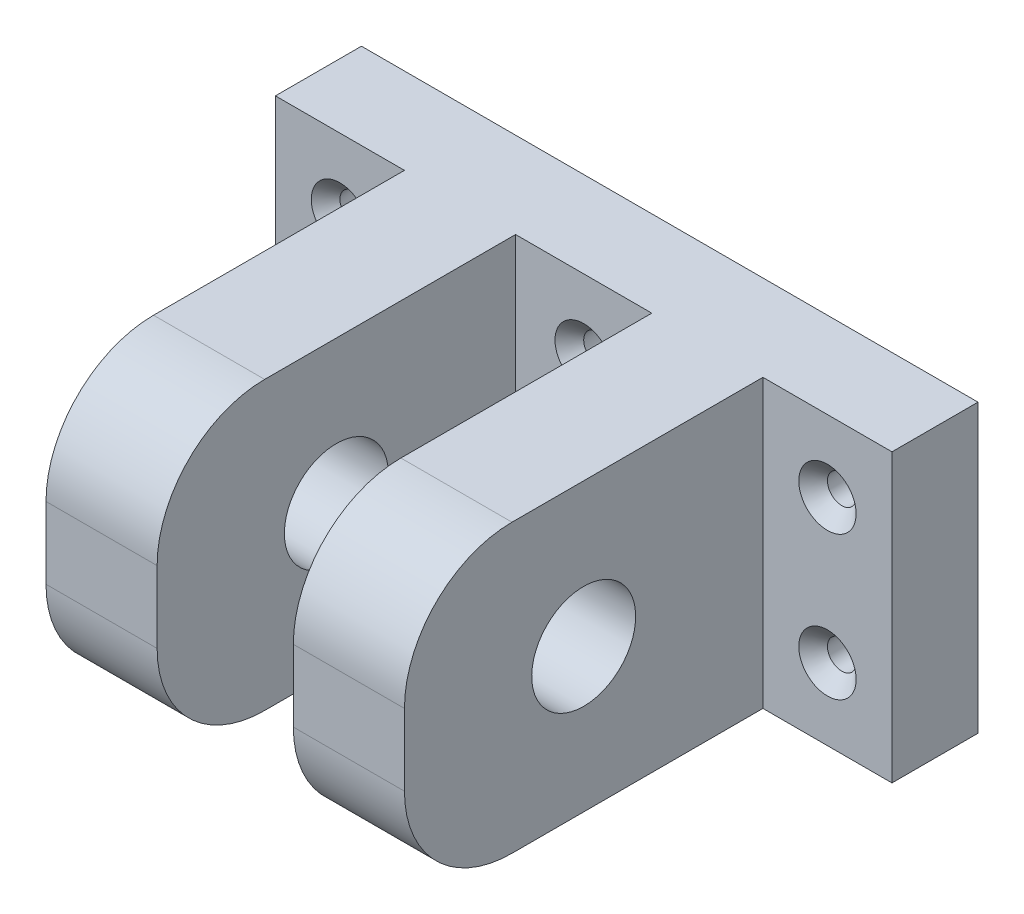
ISO-10303-21;
HEADER;
FILE_DESCRIPTION(('STEP AP214'),'2;1');
FILE_NAME('part.step','',(''),(''),'','','');
FILE_SCHEMA(('AUTOMOTIVE_DESIGN { 1 0 10303 214 1 1 1 1 }'));
ENDSEC;
DATA;
#1=APPLICATION_CONTEXT('core data for automotive mechanical design processes');
#2=APPLICATION_PROTOCOL_DEFINITION('international standard','automotive_design',2000,#1);
#3=PRODUCT_CONTEXT('',#1,'mechanical');
#4=PRODUCT('Part','Part','',(#3));
#5=PRODUCT_RELATED_PRODUCT_CATEGORY('part','',(#4));
#6=PRODUCT_DEFINITION_FORMATION('','',#4);
#7=PRODUCT_DEFINITION_CONTEXT('part definition',#1,'design');
#8=PRODUCT_DEFINITION('design','',#6,#7);
#9=PRODUCT_DEFINITION_SHAPE('','',#8);
#10=(LENGTH_UNIT() NAMED_UNIT(*) SI_UNIT(.MILLI.,.METRE.));
#11=(NAMED_UNIT(*) PLANE_ANGLE_UNIT() SI_UNIT($,.RADIAN.));
#12=(NAMED_UNIT(*) SI_UNIT($,.STERADIAN.) SOLID_ANGLE_UNIT());
#13=UNCERTAINTY_MEASURE_WITH_UNIT(LENGTH_MEASURE(1.E-05),#10,'distance_accuracy_value','');
#14=(GEOMETRIC_REPRESENTATION_CONTEXT(3) GLOBAL_UNCERTAINTY_ASSIGNED_CONTEXT((#13)) GLOBAL_UNIT_ASSIGNED_CONTEXT((#10,
#11,#12)) REPRESENTATION_CONTEXT('',''));
#15=CARTESIAN_POINT('',(0.,0.,0.));
#16=DIRECTION('',(0.,0.,1.));
#17=DIRECTION('',(1.,0.,0.));
#18=AXIS2_PLACEMENT_3D('',#15,#16,#17);
#19=CARTESIAN_POINT('',(0.,0.,12.));
#20=DIRECTION('',(0.,0.,-1.));
#21=DIRECTION('',(-1.,0.,0.));
#22=AXIS2_PLACEMENT_3D('',#19,#20,#21);
#23=PLANE('',#22);
#24=CARTESIAN_POINT('',(43.,10.,12.));
#25=DIRECTION('',(0.,0.,-1.));
#26=DIRECTION('',(-1.,0.,0.));
#27=AXIS2_PLACEMENT_3D('',#24,#25,#26);
#28=CIRCLE('',#27,4.);
#29=CARTESIAN_POINT('',(39.,10.,12.));
#30=VERTEX_POINT('',#29);
#31=EDGE_CURVE('E314',#30,#30,#28,.T.);
#32=ORIENTED_EDGE('',*,*,#31,.T.);
#33=EDGE_LOOP('',(#32));
#34=FACE_BOUND('',#33,.T.);
#35=CARTESIAN_POINT('',(43.,30.,12.));
#36=DIRECTION('',(0.,0.,-1.));
#37=DIRECTION('',(-1.,0.,0.));
#38=AXIS2_PLACEMENT_3D('',#35,#36,#37);
#39=CIRCLE('',#38,4.);
#40=CARTESIAN_POINT('',(39.,30.,12.));
#41=VERTEX_POINT('',#40);
#42=EDGE_CURVE('E311',#41,#41,#39,.T.);
#43=ORIENTED_EDGE('',*,*,#42,.T.);
#44=EDGE_LOOP('',(#43));
#45=FACE_BOUND('',#44,.T.);
#46=DIRECTION('',(0.,-1.,0.));
#47=VECTOR('',#46,1.);
#48=CARTESIAN_POINT('',(52.5,40.,12.));
#49=LINE('',#48,#47);
#50=CARTESIAN_POINT('',(52.5,40.,12.));
#51=VERTEX_POINT('',#50);
#52=CARTESIAN_POINT('',(52.5,0.,12.));
#53=VERTEX_POINT('',#52);
#54=EDGE_CURVE('E155',#51,#53,#49,.T.);
#55=ORIENTED_EDGE('',*,*,#54,.F.);
#56=DIRECTION('',(-1.,0.,0.));
#57=VECTOR('',#56,1.);
#58=CARTESIAN_POINT('',(0.,40.,12.));
#59=LINE('',#58,#57);
#60=CARTESIAN_POINT('',(33.5,40.,12.));
#61=VERTEX_POINT('',#60);
#62=EDGE_CURVE('E163',#51,#61,#59,.T.);
#63=ORIENTED_EDGE('',*,*,#62,.T.);
#64=DIRECTION('',(0.,1.,0.));
#65=VECTOR('',#64,1.);
#66=CARTESIAN_POINT('',(33.5,40.,12.));
#67=LINE('',#66,#65);
#68=CARTESIAN_POINT('',(33.5,0.,12.));
#69=VERTEX_POINT('',#68);
#70=EDGE_CURVE('E199',#69,#61,#67,.T.);
#71=ORIENTED_EDGE('',*,*,#70,.F.);
#72=DIRECTION('',(1.,0.,0.));
#73=VECTOR('',#72,1.);
#74=CARTESIAN_POINT('',(0.,0.,12.));
#75=LINE('',#74,#73);
#76=EDGE_CURVE('E176',#69,#53,#75,.T.);
#77=ORIENTED_EDGE('',*,*,#76,.T.);
#78=EDGE_LOOP('',(#55,#63,#71,#77));
#79=FACE_BOUND('',#78,.T.);
#80=ADVANCED_FACE('F35',(#34,#45,#79),#23,.F.);
#81=CARTESIAN_POINT('',(77.,10.,12.));
#82=DIRECTION('',(0.,0.,-1.));
#83=DIRECTION('',(-1.,0.,0.));
#84=AXIS2_PLACEMENT_3D('',#81,#82,#83);
#85=CIRCLE('',#84,4.);
#86=CARTESIAN_POINT('',(73.,10.,12.));
#87=VERTEX_POINT('',#86);
#88=EDGE_CURVE('E302',#87,#87,#85,.T.);
#89=ORIENTED_EDGE('',*,*,#88,.T.);
#90=EDGE_LOOP('',(#89));
#91=FACE_BOUND('',#90,.T.);
#92=CARTESIAN_POINT('',(77.,30.,12.));
#93=DIRECTION('',(0.,0.,-1.));
#94=DIRECTION('',(-1.,0.,0.));
#95=AXIS2_PLACEMENT_3D('',#92,#93,#94);
#96=CIRCLE('',#95,4.);
#97=CARTESIAN_POINT('',(73.,30.,12.));
#98=VERTEX_POINT('',#97);
#99=EDGE_CURVE('E299',#98,#98,#96,.T.);
#100=ORIENTED_EDGE('',*,*,#99,.T.);
#101=EDGE_LOOP('',(#100));
#102=FACE_BOUND('',#101,.T.);
#103=DIRECTION('',(0.,1.,0.));
#104=VECTOR('',#103,1.);
#105=CARTESIAN_POINT('',(68.,40.,12.));
#106=LINE('',#105,#104);
#107=CARTESIAN_POINT('',(68.,0.,12.));
#108=VERTEX_POINT('',#107);
#109=CARTESIAN_POINT('',(68.,40.,12.));
#110=VERTEX_POINT('',#109);
#111=EDGE_CURVE('E177',#108,#110,#106,.T.);
#112=ORIENTED_EDGE('',*,*,#111,.F.);
#113=CARTESIAN_POINT('',(86.,0.,12.));
#114=VERTEX_POINT('',#113);
#115=EDGE_CURVE('E216',#108,#114,#75,.T.);
#116=ORIENTED_EDGE('',*,*,#115,.T.);
#117=DIRECTION('',(0.,1.,0.));
#118=VECTOR('',#117,1.);
#119=CARTESIAN_POINT('',(86.,0.,12.));
#120=LINE('',#119,#118);
#121=CARTESIAN_POINT('',(86.,40.,12.));
#122=VERTEX_POINT('',#121);
#123=EDGE_CURVE('E221',#114,#122,#120,.T.);
#124=ORIENTED_EDGE('',*,*,#123,.T.);
#125=EDGE_CURVE('E171',#122,#110,#59,.T.);
#126=ORIENTED_EDGE('',*,*,#125,.T.);
#127=EDGE_LOOP('',(#112,#116,#124,#126));
#128=FACE_BOUND('',#127,.T.);
#129=ADVANCED_FACE('F369',(#91,#102,#128),#23,.F.);
#130=CARTESIAN_POINT('',(9.,10.,12.));
#131=DIRECTION('',(0.,0.,-1.));
#132=DIRECTION('',(-1.,0.,0.));
#133=AXIS2_PLACEMENT_3D('',#130,#131,#132);
#134=CIRCLE('',#133,4.00000000000001);
#135=CARTESIAN_POINT('',(4.99999999999999,10.,12.));
#136=VERTEX_POINT('',#135);
#137=EDGE_CURVE('E44',#136,#136,#134,.T.);
#138=ORIENTED_EDGE('',*,*,#137,.T.);
#139=EDGE_LOOP('',(#138));
#140=FACE_BOUND('',#139,.T.);
#141=CARTESIAN_POINT('',(9.,30.,12.));
#142=DIRECTION('',(0.,0.,-1.));
#143=DIRECTION('',(-1.,0.,0.));
#144=AXIS2_PLACEMENT_3D('',#141,#142,#143);
#145=CIRCLE('',#144,4.00000000000001);
#146=CARTESIAN_POINT('',(4.99999999999999,30.,12.));
#147=VERTEX_POINT('',#146);
#148=EDGE_CURVE('E323',#147,#147,#145,.T.);
#149=ORIENTED_EDGE('',*,*,#148,.T.);
#150=EDGE_LOOP('',(#149));
#151=FACE_BOUND('',#150,.T.);
#152=DIRECTION('',(0.,-1.,0.));
#153=VECTOR('',#152,1.);
#154=CARTESIAN_POINT('',(18.,40.,12.));
#155=LINE('',#154,#153);
#156=CARTESIAN_POINT('',(18.,40.,12.));
#157=VERTEX_POINT('',#156);
#158=CARTESIAN_POINT('',(18.,0.,12.));
#159=VERTEX_POINT('',#158);
#160=EDGE_CURVE('E194',#157,#159,#155,.T.);
#161=ORIENTED_EDGE('',*,*,#160,.F.);
#162=CARTESIAN_POINT('',(0.,40.,12.));
#163=VERTEX_POINT('',#162);
#164=EDGE_CURVE('E172',#157,#163,#59,.T.);
#165=ORIENTED_EDGE('',*,*,#164,.T.);
#166=DIRECTION('',(0.,-1.,0.));
#167=VECTOR('',#166,1.);
#168=CARTESIAN_POINT('',(0.,0.,12.));
#169=LINE('',#168,#167);
#170=CARTESIAN_POINT('',(0.,0.,12.));
#171=VERTEX_POINT('',#170);
#172=EDGE_CURVE('E213',#163,#171,#169,.T.);
#173=ORIENTED_EDGE('',*,*,#172,.T.);
#174=EDGE_CURVE('E218',#171,#159,#75,.T.);
#175=ORIENTED_EDGE('',*,*,#174,.T.);
#176=EDGE_LOOP('',(#161,#165,#173,#175));
#177=FACE_BOUND('',#176,.T.);
#178=ADVANCED_FACE('F391',(#140,#151,#177),#23,.F.);
#179=CARTESIAN_POINT('',(0.,0.,12.));
#180=DIRECTION('',(1.,0.,0.));
#181=DIRECTION('',(0.,0.,-1.));
#182=AXIS2_PLACEMENT_3D('',#179,#180,#181);
#183=PLANE('',#182);
#184=DIRECTION('',(0.,-1.,0.));
#185=VECTOR('',#184,1.);
#186=CARTESIAN_POINT('',(0.,0.,0.));
#187=LINE('',#186,#185);
#188=CARTESIAN_POINT('',(0.,40.,0.));
#189=VERTEX_POINT('',#188);
#190=CARTESIAN_POINT('',(0.,0.,0.));
#191=VERTEX_POINT('',#190);
#192=EDGE_CURVE('E212',#189,#191,#187,.T.);
#193=ORIENTED_EDGE('',*,*,#192,.T.);
#194=DIRECTION('',(0.,0.,-1.));
#195=VECTOR('',#194,1.);
#196=CARTESIAN_POINT('',(0.,0.,12.));
#197=LINE('',#196,#195);
#198=EDGE_CURVE('E240',#171,#191,#197,.T.);
#199=ORIENTED_EDGE('',*,*,#198,.F.);
#200=ORIENTED_EDGE('',*,*,#172,.F.);
#201=DIRECTION('',(0.,0.,-1.));
#202=VECTOR('',#201,1.);
#203=CARTESIAN_POINT('',(0.,40.,12.));
#204=LINE('',#203,#202);
#205=EDGE_CURVE('E224',#163,#189,#204,.T.);
#206=ORIENTED_EDGE('',*,*,#205,.T.);
#207=EDGE_LOOP('',(#193,#199,#200,#206));
#208=FACE_BOUND('',#207,.T.);
#209=ADVANCED_FACE('F385',(#208),#183,.F.);
#210=CARTESIAN_POINT('',(0.,0.,12.));
#211=DIRECTION('',(0.,1.,0.));
#212=DIRECTION('',(0.,0.,1.));
#213=AXIS2_PLACEMENT_3D('',#210,#211,#212);
#214=PLANE('',#213);
#215=DIRECTION('',(0.,0.,-1.));
#216=VECTOR('',#215,1.);
#217=CARTESIAN_POINT('',(33.5,0.,62.));
#218=LINE('',#217,#216);
#219=CARTESIAN_POINT('',(33.5,0.,47.));
#220=VERTEX_POINT('',#219);
#221=EDGE_CURVE('E208',#220,#69,#218,.T.);
#222=ORIENTED_EDGE('',*,*,#221,.F.);
#223=DIRECTION('',(1.,0.,0.));
#224=VECTOR('',#223,1.);
#225=CARTESIAN_POINT('',(18.,0.,47.));
#226=LINE('',#225,#224);
#227=CARTESIAN_POINT('',(18.,0.,47.));
#228=VERTEX_POINT('',#227);
#229=EDGE_CURVE('E274',#220,#228,#226,.F.);
#230=ORIENTED_EDGE('',*,*,#229,.T.);
#231=DIRECTION('',(0.,0.,-1.));
#232=VECTOR('',#231,1.);
#233=CARTESIAN_POINT('',(18.,0.,62.));
#234=LINE('',#233,#232);
#235=EDGE_CURVE('E210',#228,#159,#234,.T.);
#236=ORIENTED_EDGE('',*,*,#235,.T.);
#237=ORIENTED_EDGE('',*,*,#174,.F.);
#238=ORIENTED_EDGE('',*,*,#198,.T.);
#239=DIRECTION('',(1.,0.,0.));
#240=VECTOR('',#239,1.);
#241=CARTESIAN_POINT('',(0.,0.,0.));
#242=LINE('',#241,#240);
#243=CARTESIAN_POINT('',(86.,0.,0.));
#244=VERTEX_POINT('',#243);
#245=EDGE_CURVE('E227',#191,#244,#242,.T.);
#246=ORIENTED_EDGE('',*,*,#245,.T.);
#247=DIRECTION('',(0.,0.,-1.));
#248=VECTOR('',#247,1.);
#249=CARTESIAN_POINT('',(86.,0.,12.));
#250=LINE('',#249,#248);
#251=EDGE_CURVE('E237',#114,#244,#250,.T.);
#252=ORIENTED_EDGE('',*,*,#251,.F.);
#253=ORIENTED_EDGE('',*,*,#115,.F.);
#254=DIRECTION('',(0.,0.,-1.));
#255=VECTOR('',#254,1.);
#256=CARTESIAN_POINT('',(68.,0.,62.));
#257=LINE('',#256,#255);
#258=CARTESIAN_POINT('',(68.,0.,47.));
#259=VERTEX_POINT('',#258);
#260=EDGE_CURVE('E190',#259,#108,#257,.T.);
#261=ORIENTED_EDGE('',*,*,#260,.F.);
#262=DIRECTION('',(1.,0.,0.));
#263=VECTOR('',#262,1.);
#264=CARTESIAN_POINT('',(52.5,0.,47.));
#265=LINE('',#264,#263);
#266=CARTESIAN_POINT('',(52.5,0.,47.));
#267=VERTEX_POINT('',#266);
#268=EDGE_CURVE('E59',#259,#267,#265,.F.);
#269=ORIENTED_EDGE('',*,*,#268,.T.);
#270=DIRECTION('',(0.,0.,-1.));
#271=VECTOR('',#270,1.);
#272=CARTESIAN_POINT('',(52.5,0.,62.));
#273=LINE('',#272,#271);
#274=EDGE_CURVE('E192',#267,#53,#273,.T.);
#275=ORIENTED_EDGE('',*,*,#274,.T.);
#276=ORIENTED_EDGE('',*,*,#76,.F.);
#277=EDGE_LOOP('',(#222,#230,#236,#237,#238,#246,#252,#253,#261,#269,#275,#276));
#278=FACE_BOUND('',#277,.T.);
#279=ADVANCED_FACE('F372',(#278),#214,.F.);
#280=CARTESIAN_POINT('',(86.,0.,12.));
#281=DIRECTION('',(-1.,0.,0.));
#282=DIRECTION('',(0.,0.,1.));
#283=AXIS2_PLACEMENT_3D('',#280,#281,#282);
#284=PLANE('',#283);
#285=DIRECTION('',(0.,1.,0.));
#286=VECTOR('',#285,1.);
#287=CARTESIAN_POINT('',(86.,0.,0.));
#288=LINE('',#287,#286);
#289=CARTESIAN_POINT('',(86.,40.,0.));
#290=VERTEX_POINT('',#289);
#291=EDGE_CURVE('E229',#244,#290,#288,.T.);
#292=ORIENTED_EDGE('',*,*,#291,.T.);
#293=DIRECTION('',(0.,0.,-1.));
#294=VECTOR('',#293,1.);
#295=CARTESIAN_POINT('',(86.,40.,12.));
#296=LINE('',#295,#294);
#297=EDGE_CURVE('E234',#122,#290,#296,.T.);
#298=ORIENTED_EDGE('',*,*,#297,.F.);
#299=ORIENTED_EDGE('',*,*,#123,.F.);
#300=ORIENTED_EDGE('',*,*,#251,.T.);
#301=EDGE_LOOP('',(#292,#298,#299,#300));
#302=FACE_BOUND('',#301,.T.);
#303=ADVANCED_FACE('F377',(#302),#284,.F.);
#304=CARTESIAN_POINT('',(0.,40.,12.));
#305=DIRECTION('',(0.,-1.,0.));
#306=DIRECTION('',(0.,0.,-1.));
#307=AXIS2_PLACEMENT_3D('',#304,#305,#306);
#308=PLANE('',#307);
#309=DIRECTION('',(0.,0.,-1.));
#310=VECTOR('',#309,1.);
#311=CARTESIAN_POINT('',(18.,40.,62.));
#312=LINE('',#311,#310);
#313=CARTESIAN_POINT('',(18.,40.,47.));
#314=VERTEX_POINT('',#313);
#315=EDGE_CURVE('E202',#314,#157,#312,.T.);
#316=ORIENTED_EDGE('',*,*,#315,.F.);
#317=DIRECTION('',(-1.,0.,0.));
#318=VECTOR('',#317,1.);
#319=CARTESIAN_POINT('',(33.5,40.,47.));
#320=LINE('',#319,#318);
#321=CARTESIAN_POINT('',(33.5,40.,47.));
#322=VERTEX_POINT('',#321);
#323=EDGE_CURVE('E255',#314,#322,#320,.F.);
#324=ORIENTED_EDGE('',*,*,#323,.T.);
#325=DIRECTION('',(0.,0.,-1.));
#326=VECTOR('',#325,1.);
#327=CARTESIAN_POINT('',(33.5,40.,62.));
#328=LINE('',#327,#326);
#329=EDGE_CURVE('E167',#322,#61,#328,.T.);
#330=ORIENTED_EDGE('',*,*,#329,.T.);
#331=ORIENTED_EDGE('',*,*,#62,.F.);
#332=DIRECTION('',(0.,0.,-1.));
#333=VECTOR('',#332,1.);
#334=CARTESIAN_POINT('',(52.5,40.,62.));
#335=LINE('',#334,#333);
#336=CARTESIAN_POINT('',(52.5,40.,47.));
#337=VERTEX_POINT('',#336);
#338=EDGE_CURVE('E150',#337,#51,#335,.T.);
#339=ORIENTED_EDGE('',*,*,#338,.F.);
#340=DIRECTION('',(-1.,0.,0.));
#341=VECTOR('',#340,1.);
#342=CARTESIAN_POINT('',(68.,40.,47.));
#343=LINE('',#342,#341);
#344=CARTESIAN_POINT('',(68.,40.,47.));
#345=VERTEX_POINT('',#344);
#346=EDGE_CURVE('E253',#337,#345,#343,.F.);
#347=ORIENTED_EDGE('',*,*,#346,.T.);
#348=DIRECTION('',(0.,0.,-1.));
#349=VECTOR('',#348,1.);
#350=CARTESIAN_POINT('',(68.,40.,62.));
#351=LINE('',#350,#349);
#352=EDGE_CURVE('E159',#345,#110,#351,.T.);
#353=ORIENTED_EDGE('',*,*,#352,.T.);
#354=ORIENTED_EDGE('',*,*,#125,.F.);
#355=ORIENTED_EDGE('',*,*,#297,.T.);
#356=DIRECTION('',(-1.,0.,0.));
#357=VECTOR('',#356,1.);
#358=CARTESIAN_POINT('',(0.,40.,0.));
#359=LINE('',#358,#357);
#360=EDGE_CURVE('E217',#290,#189,#359,.T.);
#361=ORIENTED_EDGE('',*,*,#360,.T.);
#362=ORIENTED_EDGE('',*,*,#205,.F.);
#363=ORIENTED_EDGE('',*,*,#164,.F.);
#364=EDGE_LOOP('',(#316,#324,#330,#331,#339,#347,#353,#354,#355,#361,#362,#363));
#365=FACE_BOUND('',#364,.T.);
#366=ADVANCED_FACE('F165',(#365),#308,.F.);
#367=CARTESIAN_POINT('',(0.,0.,0.));
#368=DIRECTION('',(0.,0.,-1.));
#369=DIRECTION('',(-1.,0.,0.));
#370=AXIS2_PLACEMENT_3D('',#367,#368,#369);
#371=PLANE('',#370);
#372=CARTESIAN_POINT('',(40.,20.,0.));
#373=DIRECTION('',(0.,0.,-1.));
#374=DIRECTION('',(-1.,0.,0.));
#375=AXIS2_PLACEMENT_3D('',#372,#373,#374);
#376=CIRCLE('',#375,5.);
#377=CARTESIAN_POINT('',(35.,20.,0.));
#378=VERTEX_POINT('',#377);
#379=EDGE_CURVE('E343',#378,#378,#376,.T.);
#380=ORIENTED_EDGE('',*,*,#379,.F.);
#381=EDGE_LOOP('',(#380));
#382=FACE_BOUND('',#381,.T.);
#383=CARTESIAN_POINT('',(10.,20.,0.));
#384=DIRECTION('',(0.,0.,-1.));
#385=DIRECTION('',(-1.,0.,0.));
#386=AXIS2_PLACEMENT_3D('',#383,#384,#385);
#387=CIRCLE('',#386,5.);
#388=CARTESIAN_POINT('',(5.,20.,0.));
#389=VERTEX_POINT('',#388);
#390=EDGE_CURVE('E336',#389,#389,#387,.T.);
#391=ORIENTED_EDGE('',*,*,#390,.F.);
#392=EDGE_LOOP('',(#391));
#393=FACE_BOUND('',#392,.T.);
#394=CARTESIAN_POINT('',(77.,10.,0.));
#395=DIRECTION('',(0.,0.,-1.));
#396=DIRECTION('',(-1.,0.,0.));
#397=AXIS2_PLACEMENT_3D('',#394,#395,#396);
#398=CIRCLE('',#397,2.);
#399=CARTESIAN_POINT('',(75.,10.,0.));
#400=VERTEX_POINT('',#399);
#401=EDGE_CURVE('E281',#400,#400,#398,.T.);
#402=ORIENTED_EDGE('',*,*,#401,.F.);
#403=EDGE_LOOP('',(#402));
#404=FACE_BOUND('',#403,.T.);
#405=CARTESIAN_POINT('',(77.,30.,0.));
#406=DIRECTION('',(0.,0.,-1.));
#407=DIRECTION('',(-1.,0.,0.));
#408=AXIS2_PLACEMENT_3D('',#405,#406,#407);
#409=CIRCLE('',#408,2.);
#410=CARTESIAN_POINT('',(75.,30.,0.));
#411=VERTEX_POINT('',#410);
#412=EDGE_CURVE('E292',#411,#411,#409,.T.);
#413=ORIENTED_EDGE('',*,*,#412,.F.);
#414=EDGE_LOOP('',(#413));
#415=FACE_BOUND('',#414,.T.);
#416=CARTESIAN_POINT('',(43.,10.,0.));
#417=DIRECTION('',(0.,0.,-1.));
#418=DIRECTION('',(-1.,0.,0.));
#419=AXIS2_PLACEMENT_3D('',#416,#417,#418);
#420=CIRCLE('',#419,2.);
#421=CARTESIAN_POINT('',(41.,10.,0.));
#422=VERTEX_POINT('',#421);
#423=EDGE_CURVE('E289',#422,#422,#420,.T.);
#424=ORIENTED_EDGE('',*,*,#423,.F.);
#425=EDGE_LOOP('',(#424));
#426=FACE_BOUND('',#425,.T.);
#427=CARTESIAN_POINT('',(43.,30.,0.));
#428=DIRECTION('',(0.,0.,-1.));
#429=DIRECTION('',(-1.,0.,0.));
#430=AXIS2_PLACEMENT_3D('',#427,#428,#429);
#431=CIRCLE('',#430,2.);
#432=CARTESIAN_POINT('',(41.,30.,0.));
#433=VERTEX_POINT('',#432);
#434=EDGE_CURVE('E285',#433,#433,#431,.T.);
#435=ORIENTED_EDGE('',*,*,#434,.F.);
#436=EDGE_LOOP('',(#435));
#437=FACE_BOUND('',#436,.T.);
#438=CARTESIAN_POINT('',(9.,10.,0.));
#439=DIRECTION('',(0.,0.,-1.));
#440=DIRECTION('',(-1.,0.,0.));
#441=AXIS2_PLACEMENT_3D('',#438,#439,#440);
#442=CIRCLE('',#441,2.);
#443=CARTESIAN_POINT('',(7.,10.,0.));
#444=VERTEX_POINT('',#443);
#445=EDGE_CURVE('E282',#444,#444,#442,.T.);
#446=ORIENTED_EDGE('',*,*,#445,.F.);
#447=EDGE_LOOP('',(#446));
#448=FACE_BOUND('',#447,.T.);
#449=CARTESIAN_POINT('',(9.,30.,0.));
#450=DIRECTION('',(0.,0.,-1.));
#451=DIRECTION('',(-1.,0.,0.));
#452=AXIS2_PLACEMENT_3D('',#449,#450,#451);
#453=CIRCLE('',#452,2.);
#454=CARTESIAN_POINT('',(7.,30.,0.));
#455=VERTEX_POINT('',#454);
#456=EDGE_CURVE('E277',#455,#455,#453,.T.);
#457=ORIENTED_EDGE('',*,*,#456,.F.);
#458=EDGE_LOOP('',(#457));
#459=FACE_BOUND('',#458,.T.);
#460=ORIENTED_EDGE('',*,*,#192,.F.);
#461=ORIENTED_EDGE('',*,*,#360,.F.);
#462=ORIENTED_EDGE('',*,*,#291,.F.);
#463=ORIENTED_EDGE('',*,*,#245,.F.);
#464=EDGE_LOOP('',(#460,#461,#462,#463));
#465=FACE_BOUND('',#464,.T.);
#466=ADVANCED_FACE('F382',(#382,#393,#404,#415,#426,#437,#448,#459,#465),#371,.T.);
#467=CARTESIAN_POINT('',(18.,40.,62.));
#468=DIRECTION('',(1.,0.,0.));
#469=DIRECTION('',(0.,1.,0.));
#470=AXIS2_PLACEMENT_3D('',#467,#468,#469);
#471=PLANE('',#470);
#472=CARTESIAN_POINT('',(18.,20.,37.));
#473=DIRECTION('',(-1.,0.,0.));
#474=DIRECTION('',(0.,-1.,0.));
#475=AXIS2_PLACEMENT_3D('',#472,#473,#474);
#476=CIRCLE('',#475,7.25);
#477=CARTESIAN_POINT('',(18.,12.75,37.));
#478=VERTEX_POINT('',#477);
#479=EDGE_CURVE('E280',#478,#478,#476,.T.);
#480=ORIENTED_EDGE('',*,*,#479,.F.);
#481=EDGE_LOOP('',(#480));
#482=FACE_BOUND('',#481,.T.);
#483=DIRECTION('',(0.,-1.,0.));
#484=VECTOR('',#483,1.);
#485=CARTESIAN_POINT('',(18.,40.,62.));
#486=LINE('',#485,#484);
#487=CARTESIAN_POINT('',(18.,25.,62.));
#488=VERTEX_POINT('',#487);
#489=CARTESIAN_POINT('',(18.,15.,62.));
#490=VERTEX_POINT('',#489);
#491=EDGE_CURVE('E195',#488,#490,#486,.T.);
#492=ORIENTED_EDGE('',*,*,#491,.F.);
#493=CARTESIAN_POINT('',(18.,25.,47.));
#494=DIRECTION('',(1.,0.,0.));
#495=DIRECTION('',(0.,1.,0.));
#496=AXIS2_PLACEMENT_3D('',#493,#494,#495);
#497=CIRCLE('',#496,15.);
#498=EDGE_CURVE('E251',#488,#314,#497,.F.);
#499=ORIENTED_EDGE('',*,*,#498,.T.);
#500=ORIENTED_EDGE('',*,*,#315,.T.);
#501=ORIENTED_EDGE('',*,*,#160,.T.);
#502=ORIENTED_EDGE('',*,*,#235,.F.);
#503=CARTESIAN_POINT('',(18.,15.,47.));
#504=DIRECTION('',(1.,0.,0.));
#505=DIRECTION('',(0.,1.,0.));
#506=AXIS2_PLACEMENT_3D('',#503,#504,#505);
#507=CIRCLE('',#506,15.);
#508=EDGE_CURVE('E249',#228,#490,#507,.F.);
#509=ORIENTED_EDGE('',*,*,#508,.T.);
#510=EDGE_LOOP('',(#492,#499,#500,#501,#502,#509));
#511=FACE_BOUND('',#510,.T.);
#512=ADVANCED_FACE('F395',(#482,#511),#471,.F.);
#513=CARTESIAN_POINT('',(33.5,40.,62.));
#514=DIRECTION('',(-1.,0.,0.));
#515=DIRECTION('',(0.,-1.,0.));
#516=AXIS2_PLACEMENT_3D('',#513,#514,#515);
#517=PLANE('',#516);
#518=CARTESIAN_POINT('',(33.5,20.,37.));
#519=DIRECTION('',(-1.,0.,0.));
#520=DIRECTION('',(0.,-1.,0.));
#521=AXIS2_PLACEMENT_3D('',#518,#519,#520);
#522=CIRCLE('',#521,7.25);
#523=CARTESIAN_POINT('',(33.5,12.75,37.));
#524=VERTEX_POINT('',#523);
#525=EDGE_CURVE('E178',#524,#524,#522,.T.);
#526=ORIENTED_EDGE('',*,*,#525,.T.);
#527=EDGE_LOOP('',(#526));
#528=FACE_BOUND('',#527,.T.);
#529=ORIENTED_EDGE('',*,*,#329,.F.);
#530=CARTESIAN_POINT('',(33.5,25.,47.));
#531=DIRECTION('',(-1.,0.,0.));
#532=DIRECTION('',(0.,-1.,0.));
#533=AXIS2_PLACEMENT_3D('',#530,#531,#532);
#534=CIRCLE('',#533,15.);
#535=CARTESIAN_POINT('',(33.5,25.,62.));
#536=VERTEX_POINT('',#535);
#537=EDGE_CURVE('E259',#322,#536,#534,.F.);
#538=ORIENTED_EDGE('',*,*,#537,.T.);
#539=DIRECTION('',(0.,1.,0.));
#540=VECTOR('',#539,1.);
#541=CARTESIAN_POINT('',(33.5,40.,62.));
#542=LINE('',#541,#540);
#543=CARTESIAN_POINT('',(33.5,15.,62.));
#544=VERTEX_POINT('',#543);
#545=EDGE_CURVE('E198',#544,#536,#542,.T.);
#546=ORIENTED_EDGE('',*,*,#545,.F.);
#547=CARTESIAN_POINT('',(33.5,15.,47.));
#548=DIRECTION('',(-1.,0.,0.));
#549=DIRECTION('',(0.,-1.,0.));
#550=AXIS2_PLACEMENT_3D('',#547,#548,#549);
#551=CIRCLE('',#550,15.);
#552=EDGE_CURVE('E257',#544,#220,#551,.F.);
#553=ORIENTED_EDGE('',*,*,#552,.T.);
#554=ORIENTED_EDGE('',*,*,#221,.T.);
#555=ORIENTED_EDGE('',*,*,#70,.T.);
#556=EDGE_LOOP('',(#529,#538,#546,#553,#554,#555));
#557=FACE_BOUND('',#556,.T.);
#558=ADVANCED_FACE('F406',(#528,#557),#517,.F.);
#559=CARTESIAN_POINT('',(0.,0.,62.));
#560=DIRECTION('',(0.,0.,1.));
#561=DIRECTION('',(1.,0.,0.));
#562=AXIS2_PLACEMENT_3D('',#559,#560,#561);
#563=PLANE('',#562);
#564=ORIENTED_EDGE('',*,*,#545,.T.);
#565=DIRECTION('',(-1.,0.,0.));
#566=VECTOR('',#565,1.);
#567=CARTESIAN_POINT('',(18.,25.,62.));
#568=LINE('',#567,#566);
#569=EDGE_CURVE('E246',#536,#488,#568,.T.);
#570=ORIENTED_EDGE('',*,*,#569,.T.);
#571=ORIENTED_EDGE('',*,*,#491,.T.);
#572=DIRECTION('',(1.,0.,0.));
#573=VECTOR('',#572,1.);
#574=CARTESIAN_POINT('',(33.5,15.,62.));
#575=LINE('',#574,#573);
#576=EDGE_CURVE('E243',#490,#544,#575,.T.);
#577=ORIENTED_EDGE('',*,*,#576,.T.);
#578=EDGE_LOOP('',(#564,#570,#571,#577));
#579=FACE_BOUND('',#578,.T.);
#580=ADVANCED_FACE('F402',(#579),#563,.T.);
#581=CARTESIAN_POINT('',(52.5,40.,62.));
#582=DIRECTION('',(1.,0.,0.));
#583=DIRECTION('',(0.,1.,0.));
#584=AXIS2_PLACEMENT_3D('',#581,#582,#583);
#585=PLANE('',#584);
#586=CARTESIAN_POINT('',(52.5,20.,37.));
#587=DIRECTION('',(1.,0.,0.));
#588=DIRECTION('',(0.,1.,0.));
#589=AXIS2_PLACEMENT_3D('',#586,#587,#588);
#590=CIRCLE('',#589,7.25);
#591=CARTESIAN_POINT('',(52.5,27.25,37.));
#592=VERTEX_POINT('',#591);
#593=EDGE_CURVE('E184',#592,#592,#590,.T.);
#594=ORIENTED_EDGE('',*,*,#593,.T.);
#595=EDGE_LOOP('',(#594));
#596=FACE_BOUND('',#595,.T.);
#597=DIRECTION('',(0.,-1.,0.));
#598=VECTOR('',#597,1.);
#599=CARTESIAN_POINT('',(52.5,40.,62.));
#600=LINE('',#599,#598);
#601=CARTESIAN_POINT('',(52.5,25.,62.));
#602=VERTEX_POINT('',#601);
#603=CARTESIAN_POINT('',(52.5,15.,62.));
#604=VERTEX_POINT('',#603);
#605=EDGE_CURVE('E181',#602,#604,#600,.T.);
#606=ORIENTED_EDGE('',*,*,#605,.F.);
#607=CARTESIAN_POINT('',(52.5,25.,47.));
#608=DIRECTION('',(1.,0.,0.));
#609=DIRECTION('',(0.,1.,0.));
#610=AXIS2_PLACEMENT_3D('',#607,#608,#609);
#611=CIRCLE('',#610,15.);
#612=EDGE_CURVE('E156',#602,#337,#611,.F.);
#613=ORIENTED_EDGE('',*,*,#612,.T.);
#614=ORIENTED_EDGE('',*,*,#338,.T.);
#615=ORIENTED_EDGE('',*,*,#54,.T.);
#616=ORIENTED_EDGE('',*,*,#274,.F.);
#617=CARTESIAN_POINT('',(52.5,15.,47.));
#618=DIRECTION('',(1.,0.,0.));
#619=DIRECTION('',(0.,1.,0.));
#620=AXIS2_PLACEMENT_3D('',#617,#618,#619);
#621=CIRCLE('',#620,15.);
#622=EDGE_CURVE('E267',#267,#604,#621,.F.);
#623=ORIENTED_EDGE('',*,*,#622,.T.);
#624=EDGE_LOOP('',(#606,#613,#614,#615,#616,#623));
#625=FACE_BOUND('',#624,.T.);
#626=ADVANCED_FACE('F153',(#596,#625),#585,.F.);
#627=CARTESIAN_POINT('',(68.,40.,62.));
#628=DIRECTION('',(-1.,0.,0.));
#629=DIRECTION('',(0.,0.,1.));
#630=AXIS2_PLACEMENT_3D('',#627,#628,#629);
#631=PLANE('',#630);
#632=CARTESIAN_POINT('',(68.,20.,37.));
#633=DIRECTION('',(-1.,0.,0.));
#634=DIRECTION('',(0.,-1.,0.));
#635=AXIS2_PLACEMENT_3D('',#632,#633,#634);
#636=CIRCLE('',#635,7.25);
#637=CARTESIAN_POINT('',(68.,12.75,37.));
#638=VERTEX_POINT('',#637);
#639=EDGE_CURVE('E348',#638,#638,#636,.T.);
#640=ORIENTED_EDGE('',*,*,#639,.T.);
#641=EDGE_LOOP('',(#640));
#642=FACE_BOUND('',#641,.T.);
#643=ORIENTED_EDGE('',*,*,#352,.F.);
#644=CARTESIAN_POINT('',(68.,25.,47.));
#645=DIRECTION('',(-1.,0.,0.));
#646=DIRECTION('',(0.,0.,1.));
#647=AXIS2_PLACEMENT_3D('',#644,#645,#646);
#648=CIRCLE('',#647,15.);
#649=CARTESIAN_POINT('',(68.,25.,62.));
#650=VERTEX_POINT('',#649);
#651=EDGE_CURVE('E271',#345,#650,#648,.F.);
#652=ORIENTED_EDGE('',*,*,#651,.T.);
#653=DIRECTION('',(0.,1.,0.));
#654=VECTOR('',#653,1.);
#655=CARTESIAN_POINT('',(68.,40.,62.));
#656=LINE('',#655,#654);
#657=CARTESIAN_POINT('',(68.,15.,62.));
#658=VERTEX_POINT('',#657);
#659=EDGE_CURVE('E160',#658,#650,#656,.T.);
#660=ORIENTED_EDGE('',*,*,#659,.F.);
#661=CARTESIAN_POINT('',(68.,15.,47.));
#662=DIRECTION('',(-1.,0.,0.));
#663=DIRECTION('',(0.,0.,1.));
#664=AXIS2_PLACEMENT_3D('',#661,#662,#663);
#665=CIRCLE('',#664,15.);
#666=EDGE_CURVE('E52',#658,#259,#665,.F.);
#667=ORIENTED_EDGE('',*,*,#666,.T.);
#668=ORIENTED_EDGE('',*,*,#260,.T.);
#669=ORIENTED_EDGE('',*,*,#111,.T.);
#670=EDGE_LOOP('',(#643,#652,#660,#667,#668,#669));
#671=FACE_BOUND('',#670,.T.);
#672=ADVANCED_FACE('F365',(#642,#671),#631,.F.);
#673=CARTESIAN_POINT('',(0.,0.,62.));
#674=DIRECTION('',(0.,0.,1.));
#675=DIRECTION('',(1.,0.,0.));
#676=AXIS2_PLACEMENT_3D('',#673,#674,#675);
#677=PLANE('',#676);
#678=ORIENTED_EDGE('',*,*,#659,.T.);
#679=DIRECTION('',(-1.,0.,0.));
#680=VECTOR('',#679,1.);
#681=CARTESIAN_POINT('',(52.5,25.,62.));
#682=LINE('',#681,#680);
#683=EDGE_CURVE('E264',#650,#602,#682,.T.);
#684=ORIENTED_EDGE('',*,*,#683,.T.);
#685=ORIENTED_EDGE('',*,*,#605,.T.);
#686=DIRECTION('',(1.,0.,0.));
#687=VECTOR('',#686,1.);
#688=CARTESIAN_POINT('',(68.,15.,62.));
#689=LINE('',#688,#687);
#690=EDGE_CURVE('E261',#604,#658,#689,.T.);
#691=ORIENTED_EDGE('',*,*,#690,.T.);
#692=EDGE_LOOP('',(#678,#684,#685,#691));
#693=FACE_BOUND('',#692,.T.);
#694=ADVANCED_FACE('F359',(#693),#677,.T.);
#695=CARTESIAN_POINT('',(68.,20.,37.));
#696=DIRECTION('',(-1.,0.,0.));
#697=DIRECTION('',(0.,-1.,0.));
#698=AXIS2_PLACEMENT_3D('',#695,#696,#697);
#699=CYLINDRICAL_SURFACE('',#698,7.25);
#700=ORIENTED_EDGE('',*,*,#639,.F.);
#701=EDGE_LOOP('',(#700));
#702=FACE_BOUND('',#701,.T.);
#703=ORIENTED_EDGE('',*,*,#593,.F.);
#704=EDGE_LOOP('',(#703));
#705=FACE_BOUND('',#704,.T.);
#706=ADVANCED_FACE('F699',(#702,#705),#699,.F.);
#707=ORIENTED_EDGE('',*,*,#479,.T.);
#708=EDGE_LOOP('',(#707));
#709=FACE_BOUND('',#708,.T.);
#710=ORIENTED_EDGE('',*,*,#525,.F.);
#711=EDGE_LOOP('',(#710));
#712=FACE_BOUND('',#711,.T.);
#713=ADVANCED_FACE('F470',(#709,#712),#699,.F.);
#714=CARTESIAN_POINT('',(0.,25.,47.));
#715=DIRECTION('',(1.,0.,0.));
#716=DIRECTION('',(0.,0.,-1.));
#717=AXIS2_PLACEMENT_3D('',#714,#715,#716);
#718=CYLINDRICAL_SURFACE('',#717,15.);
#719=ORIENTED_EDGE('',*,*,#537,.F.);
#720=ORIENTED_EDGE('',*,*,#323,.F.);
#721=ORIENTED_EDGE('',*,*,#498,.F.);
#722=ORIENTED_EDGE('',*,*,#569,.F.);
#723=EDGE_LOOP('',(#719,#720,#721,#722));
#724=FACE_BOUND('',#723,.T.);
#725=ADVANCED_FACE('F400',(#724),#718,.T.);
#726=CARTESIAN_POINT('',(0.,25.,47.));
#727=DIRECTION('',(1.,0.,0.));
#728=DIRECTION('',(0.,0.,-1.));
#729=AXIS2_PLACEMENT_3D('',#726,#727,#728);
#730=CYLINDRICAL_SURFACE('',#729,15.);
#731=ORIENTED_EDGE('',*,*,#651,.F.);
#732=ORIENTED_EDGE('',*,*,#346,.F.);
#733=ORIENTED_EDGE('',*,*,#612,.F.);
#734=ORIENTED_EDGE('',*,*,#683,.F.);
#735=EDGE_LOOP('',(#731,#732,#733,#734));
#736=FACE_BOUND('',#735,.T.);
#737=ADVANCED_FACE('F362',(#736),#730,.T.);
#738=CARTESIAN_POINT('',(0.,15.,47.));
#739=DIRECTION('',(-1.,0.,0.));
#740=DIRECTION('',(0.,0.,1.));
#741=AXIS2_PLACEMENT_3D('',#738,#739,#740);
#742=CYLINDRICAL_SURFACE('',#741,15.);
#743=ORIENTED_EDGE('',*,*,#508,.F.);
#744=ORIENTED_EDGE('',*,*,#229,.F.);
#745=ORIENTED_EDGE('',*,*,#552,.F.);
#746=ORIENTED_EDGE('',*,*,#576,.F.);
#747=EDGE_LOOP('',(#743,#744,#745,#746));
#748=FACE_BOUND('',#747,.T.);
#749=ADVANCED_FACE('F413',(#748),#742,.T.);
#750=CARTESIAN_POINT('',(0.,15.,47.));
#751=DIRECTION('',(-1.,0.,0.));
#752=DIRECTION('',(0.,0.,1.));
#753=AXIS2_PLACEMENT_3D('',#750,#751,#752);
#754=CYLINDRICAL_SURFACE('',#753,15.);
#755=ORIENTED_EDGE('',*,*,#622,.F.);
#756=ORIENTED_EDGE('',*,*,#268,.F.);
#757=ORIENTED_EDGE('',*,*,#666,.F.);
#758=ORIENTED_EDGE('',*,*,#690,.F.);
#759=EDGE_LOOP('',(#755,#756,#757,#758));
#760=FACE_BOUND('',#759,.T.);
#761=ADVANCED_FACE('F410',(#760),#754,.T.);
#762=CARTESIAN_POINT('',(9.,30.,-38.));
#763=DIRECTION('',(0.,0.,1.));
#764=DIRECTION('',(1.,0.,0.));
#765=AXIS2_PLACEMENT_3D('',#762,#763,#764);
#766=CYLINDRICAL_SURFACE('',#765,2.);
#767=CARTESIAN_POINT('',(9.,30.,10.));
#768=DIRECTION('',(0.,0.,-1.));
#769=DIRECTION('',(-1.,0.,0.));
#770=AXIS2_PLACEMENT_3D('',#767,#768,#769);
#771=CIRCLE('',#770,2.);
#772=CARTESIAN_POINT('',(7.,30.,10.));
#773=VERTEX_POINT('',#772);
#774=EDGE_CURVE('E11',#773,#773,#771,.F.);
#775=ORIENTED_EDGE('',*,*,#774,.T.);
#776=EDGE_LOOP('',(#775));
#777=FACE_BOUND('',#776,.T.);
#778=ORIENTED_EDGE('',*,*,#456,.T.);
#779=EDGE_LOOP('',(#778));
#780=FACE_BOUND('',#779,.T.);
#781=ADVANCED_FACE('F412',(#777,#780),#766,.F.);
#782=CARTESIAN_POINT('',(9.,10.,-38.));
#783=DIRECTION('',(0.,0.,1.));
#784=DIRECTION('',(1.,0.,0.));
#785=AXIS2_PLACEMENT_3D('',#782,#783,#784);
#786=CYLINDRICAL_SURFACE('',#785,2.);
#787=CARTESIAN_POINT('',(9.,10.,10.));
#788=DIRECTION('',(0.,0.,-1.));
#789=DIRECTION('',(-1.,0.,0.));
#790=AXIS2_PLACEMENT_3D('',#787,#788,#789);
#791=CIRCLE('',#790,2.);
#792=CARTESIAN_POINT('',(7.,10.,10.));
#793=VERTEX_POINT('',#792);
#794=EDGE_CURVE('E320',#793,#793,#791,.F.);
#795=ORIENTED_EDGE('',*,*,#794,.T.);
#796=EDGE_LOOP('',(#795));
#797=FACE_BOUND('',#796,.T.);
#798=ORIENTED_EDGE('',*,*,#445,.T.);
#799=EDGE_LOOP('',(#798));
#800=FACE_BOUND('',#799,.T.);
#801=ADVANCED_FACE('F419',(#797,#800),#786,.F.);
#802=CARTESIAN_POINT('',(43.,30.,-38.));
#803=DIRECTION('',(0.,0.,1.));
#804=DIRECTION('',(1.,0.,0.));
#805=AXIS2_PLACEMENT_3D('',#802,#803,#804);
#806=CYLINDRICAL_SURFACE('',#805,2.);
#807=CARTESIAN_POINT('',(43.,30.,10.));
#808=DIRECTION('',(0.,0.,-1.));
#809=DIRECTION('',(-1.,0.,0.));
#810=AXIS2_PLACEMENT_3D('',#807,#808,#809);
#811=CIRCLE('',#810,2.);
#812=CARTESIAN_POINT('',(41.,30.,10.));
#813=VERTEX_POINT('',#812);
#814=EDGE_CURVE('E317',#813,#813,#811,.F.);
#815=ORIENTED_EDGE('',*,*,#814,.T.);
#816=EDGE_LOOP('',(#815));
#817=FACE_BOUND('',#816,.T.);
#818=ORIENTED_EDGE('',*,*,#434,.T.);
#819=EDGE_LOOP('',(#818));
#820=FACE_BOUND('',#819,.T.);
#821=ADVANCED_FACE('F516',(#817,#820),#806,.F.);
#822=CARTESIAN_POINT('',(43.,10.,-38.));
#823=DIRECTION('',(0.,0.,1.));
#824=DIRECTION('',(1.,0.,0.));
#825=AXIS2_PLACEMENT_3D('',#822,#823,#824);
#826=CYLINDRICAL_SURFACE('',#825,2.);
#827=CARTESIAN_POINT('',(43.,10.,10.));
#828=DIRECTION('',(0.,0.,-1.));
#829=DIRECTION('',(-1.,0.,0.));
#830=AXIS2_PLACEMENT_3D('',#827,#828,#829);
#831=CIRCLE('',#830,2.);
#832=CARTESIAN_POINT('',(41.,10.,10.));
#833=VERTEX_POINT('',#832);
#834=EDGE_CURVE('E308',#833,#833,#831,.F.);
#835=ORIENTED_EDGE('',*,*,#834,.T.);
#836=EDGE_LOOP('',(#835));
#837=FACE_BOUND('',#836,.T.);
#838=ORIENTED_EDGE('',*,*,#423,.T.);
#839=EDGE_LOOP('',(#838));
#840=FACE_BOUND('',#839,.T.);
#841=ADVANCED_FACE('F526',(#837,#840),#826,.F.);
#842=CARTESIAN_POINT('',(77.,30.,-38.));
#843=DIRECTION('',(0.,0.,1.));
#844=DIRECTION('',(1.,0.,0.));
#845=AXIS2_PLACEMENT_3D('',#842,#843,#844);
#846=CYLINDRICAL_SURFACE('',#845,2.);
#847=CARTESIAN_POINT('',(77.,30.,10.));
#848=DIRECTION('',(0.,0.,-1.));
#849=DIRECTION('',(-1.,0.,0.));
#850=AXIS2_PLACEMENT_3D('',#847,#848,#849);
#851=CIRCLE('',#850,2.);
#852=CARTESIAN_POINT('',(75.,30.,10.));
#853=VERTEX_POINT('',#852);
#854=EDGE_CURVE('E305',#853,#853,#851,.F.);
#855=ORIENTED_EDGE('',*,*,#854,.T.);
#856=EDGE_LOOP('',(#855));
#857=FACE_BOUND('',#856,.T.);
#858=ORIENTED_EDGE('',*,*,#412,.T.);
#859=EDGE_LOOP('',(#858));
#860=FACE_BOUND('',#859,.T.);
#861=ADVANCED_FACE('F536',(#857,#860),#846,.F.);
#862=CARTESIAN_POINT('',(77.,10.,-38.));
#863=DIRECTION('',(0.,0.,1.));
#864=DIRECTION('',(1.,0.,0.));
#865=AXIS2_PLACEMENT_3D('',#862,#863,#864);
#866=CYLINDRICAL_SURFACE('',#865,2.);
#867=CARTESIAN_POINT('',(77.,10.,10.));
#868=DIRECTION('',(0.,0.,-1.));
#869=DIRECTION('',(-1.,0.,0.));
#870=AXIS2_PLACEMENT_3D('',#867,#868,#869);
#871=CIRCLE('',#870,2.);
#872=CARTESIAN_POINT('',(75.,10.,10.));
#873=VERTEX_POINT('',#872);
#874=EDGE_CURVE('E276',#873,#873,#871,.F.);
#875=ORIENTED_EDGE('',*,*,#874,.T.);
#876=EDGE_LOOP('',(#875));
#877=FACE_BOUND('',#876,.T.);
#878=ORIENTED_EDGE('',*,*,#401,.T.);
#879=EDGE_LOOP('',(#878));
#880=FACE_BOUND('',#879,.T.);
#881=ADVANCED_FACE('F546',(#877,#880),#866,.F.);
#882=CARTESIAN_POINT('',(77.,10.,10.));
#883=DIRECTION('',(0.,0.,1.));
#884=DIRECTION('',(1.,0.,0.));
#885=AXIS2_PLACEMENT_3D('',#882,#883,#884);
#886=CONICAL_SURFACE('',#885,2.,0.785398163397451);
#887=ORIENTED_EDGE('',*,*,#88,.F.);
#888=EDGE_LOOP('',(#887));
#889=FACE_BOUND('',#888,.T.);
#890=ORIENTED_EDGE('',*,*,#874,.F.);
#891=EDGE_LOOP('',(#890));
#892=FACE_BOUND('',#891,.T.);
#893=ADVANCED_FACE('F556',(#889,#892),#886,.F.);
#894=CARTESIAN_POINT('',(77.,30.,10.));
#895=DIRECTION('',(0.,0.,1.));
#896=DIRECTION('',(1.,0.,0.));
#897=AXIS2_PLACEMENT_3D('',#894,#895,#896);
#898=CONICAL_SURFACE('',#897,2.,0.785398163397451);
#899=ORIENTED_EDGE('',*,*,#99,.F.);
#900=EDGE_LOOP('',(#899));
#901=FACE_BOUND('',#900,.T.);
#902=ORIENTED_EDGE('',*,*,#854,.F.);
#903=EDGE_LOOP('',(#902));
#904=FACE_BOUND('',#903,.T.);
#905=ADVANCED_FACE('F566',(#901,#904),#898,.F.);
#906=CARTESIAN_POINT('',(43.,10.,10.));
#907=DIRECTION('',(0.,0.,1.));
#908=DIRECTION('',(1.,0.,0.));
#909=AXIS2_PLACEMENT_3D('',#906,#907,#908);
#910=CONICAL_SURFACE('',#909,2.,0.785398163397451);
#911=ORIENTED_EDGE('',*,*,#31,.F.);
#912=EDGE_LOOP('',(#911));
#913=FACE_BOUND('',#912,.T.);
#914=ORIENTED_EDGE('',*,*,#834,.F.);
#915=EDGE_LOOP('',(#914));
#916=FACE_BOUND('',#915,.T.);
#917=ADVANCED_FACE('F575',(#913,#916),#910,.F.);
#918=CARTESIAN_POINT('',(43.,30.,10.));
#919=DIRECTION('',(0.,0.,1.));
#920=DIRECTION('',(1.,0.,0.));
#921=AXIS2_PLACEMENT_3D('',#918,#919,#920);
#922=CONICAL_SURFACE('',#921,2.,0.785398163397451);
#923=ORIENTED_EDGE('',*,*,#42,.F.);
#924=EDGE_LOOP('',(#923));
#925=FACE_BOUND('',#924,.T.);
#926=ORIENTED_EDGE('',*,*,#814,.F.);
#927=EDGE_LOOP('',(#926));
#928=FACE_BOUND('',#927,.T.);
#929=ADVANCED_FACE('F585',(#925,#928),#922,.F.);
#930=CARTESIAN_POINT('',(9.,10.,10.));
#931=DIRECTION('',(0.,0.,1.));
#932=DIRECTION('',(1.,0.,0.));
#933=AXIS2_PLACEMENT_3D('',#930,#931,#932);
#934=CONICAL_SURFACE('',#933,2.,0.785398163397451);
#935=ORIENTED_EDGE('',*,*,#137,.F.);
#936=EDGE_LOOP('',(#935));
#937=FACE_BOUND('',#936,.T.);
#938=ORIENTED_EDGE('',*,*,#794,.F.);
#939=EDGE_LOOP('',(#938));
#940=FACE_BOUND('',#939,.T.);
#941=ADVANCED_FACE('F448',(#937,#940),#934,.F.);
#942=CARTESIAN_POINT('',(9.,30.,10.));
#943=DIRECTION('',(0.,0.,1.));
#944=DIRECTION('',(1.,0.,0.));
#945=AXIS2_PLACEMENT_3D('',#942,#943,#944);
#946=CONICAL_SURFACE('',#945,2.,0.785398163397452);
#947=ORIENTED_EDGE('',*,*,#148,.F.);
#948=EDGE_LOOP('',(#947));
#949=FACE_BOUND('',#948,.T.);
#950=ORIENTED_EDGE('',*,*,#774,.F.);
#951=EDGE_LOOP('',(#950));
#952=FACE_BOUND('',#951,.T.);
#953=ADVANCED_FACE('F37',(#949,#952),#946,.F.);
#954=CARTESIAN_POINT('',(10.,20.,5.));
#955=DIRECTION('',(0.,0.,-1.));
#956=DIRECTION('',(-1.,0.,0.));
#957=AXIS2_PLACEMENT_3D('',#954,#955,#956);
#958=PLANE('',#957);
#959=CARTESIAN_POINT('',(10.,20.,5.));
#960=DIRECTION('',(0.,0.,-1.));
#961=DIRECTION('',(-1.,0.,0.));
#962=AXIS2_PLACEMENT_3D('',#959,#960,#961);
#963=CIRCLE('',#962,5.);
#964=CARTESIAN_POINT('',(5.,20.,5.));
#965=VERTEX_POINT('',#964);
#966=EDGE_CURVE('E330',#965,#965,#963,.T.);
#967=ORIENTED_EDGE('',*,*,#966,.T.);
#968=EDGE_LOOP('',(#967));
#969=FACE_BOUND('',#968,.T.);
#970=CARTESIAN_POINT('',(10.,20.,5.));
#971=DIRECTION('',(0.,0.,-1.));
#972=DIRECTION('',(-1.,0.,0.));
#973=AXIS2_PLACEMENT_3D('',#970,#971,#972);
#974=CIRCLE('',#973,3.);
#975=CARTESIAN_POINT('',(7.,20.,5.));
#976=VERTEX_POINT('',#975);
#977=EDGE_CURVE('E327',#976,#976,#974,.F.);
#978=ORIENTED_EDGE('',*,*,#977,.T.);
#979=EDGE_LOOP('',(#978));
#980=FACE_BOUND('',#979,.T.);
#981=ADVANCED_FACE('F447',(#969,#980),#958,.T.);
#982=CARTESIAN_POINT('',(10.,20.,5.));
#983=DIRECTION('',(0.,0.,-1.));
#984=DIRECTION('',(-1.,0.,0.));
#985=AXIS2_PLACEMENT_3D('',#982,#983,#984);
#986=CYLINDRICAL_SURFACE('',#985,5.);
#987=ORIENTED_EDGE('',*,*,#966,.F.);
#988=EDGE_LOOP('',(#987));
#989=FACE_BOUND('',#988,.T.);
#990=ORIENTED_EDGE('',*,*,#390,.T.);
#991=EDGE_LOOP('',(#990));
#992=FACE_BOUND('',#991,.T.);
#993=ADVANCED_FACE('F621',(#989,#992),#986,.F.);
#994=CARTESIAN_POINT('',(10.,20.,10.));
#995=DIRECTION('',(0.,0.,-1.));
#996=DIRECTION('',(-1.,0.,0.));
#997=AXIS2_PLACEMENT_3D('',#994,#995,#996);
#998=PLANE('',#997);
#999=CARTESIAN_POINT('',(10.,20.,10.));
#1000=DIRECTION('',(0.,0.,-1.));
#1001=DIRECTION('',(-1.,0.,0.));
#1002=AXIS2_PLACEMENT_3D('',#999,#1000,#1001);
#1003=CIRCLE('',#1002,3.);
#1004=CARTESIAN_POINT('',(7.,20.,10.));
#1005=VERTEX_POINT('',#1004);
#1006=EDGE_CURVE('E286',#1005,#1005,#1003,.T.);
#1007=ORIENTED_EDGE('',*,*,#1006,.T.);
#1008=EDGE_LOOP('',(#1007));
#1009=FACE_BOUND('',#1008,.T.);
#1010=ADVANCED_FACE('F616',(#1009),#998,.T.);
#1011=CARTESIAN_POINT('',(10.,20.,10.));
#1012=DIRECTION('',(0.,0.,-1.));
#1013=DIRECTION('',(-1.,0.,0.));
#1014=AXIS2_PLACEMENT_3D('',#1011,#1012,#1013);
#1015=CYLINDRICAL_SURFACE('',#1014,3.);
#1016=ORIENTED_EDGE('',*,*,#1006,.F.);
#1017=EDGE_LOOP('',(#1016));
#1018=FACE_BOUND('',#1017,.T.);
#1019=ORIENTED_EDGE('',*,*,#977,.F.);
#1020=EDGE_LOOP('',(#1019));
#1021=FACE_BOUND('',#1020,.T.);
#1022=ADVANCED_FACE('F620',(#1018,#1021),#1015,.F.);
#1023=CARTESIAN_POINT('',(40.,20.,5.));
#1024=DIRECTION('',(0.,0.,-1.));
#1025=DIRECTION('',(-1.,0.,0.));
#1026=AXIS2_PLACEMENT_3D('',#1023,#1024,#1025);
#1027=PLANE('',#1026);
#1028=CARTESIAN_POINT('',(40.,20.,5.));
#1029=DIRECTION('',(0.,0.,-1.));
#1030=DIRECTION('',(-1.,0.,0.));
#1031=AXIS2_PLACEMENT_3D('',#1028,#1029,#1030);
#1032=CIRCLE('',#1031,5.);
#1033=CARTESIAN_POINT('',(35.,20.,5.));
#1034=VERTEX_POINT('',#1033);
#1035=EDGE_CURVE('E812',#1034,#1034,#1032,.T.);
#1036=ORIENTED_EDGE('',*,*,#1035,.T.);
#1037=EDGE_LOOP('',(#1036));
#1038=FACE_BOUND('',#1037,.T.);
#1039=CARTESIAN_POINT('',(40.,20.,5.));
#1040=DIRECTION('',(0.,0.,-1.));
#1041=DIRECTION('',(-1.,0.,0.));
#1042=AXIS2_PLACEMENT_3D('',#1039,#1040,#1041);
#1043=CIRCLE('',#1042,3.);
#1044=CARTESIAN_POINT('',(37.,20.,5.));
#1045=VERTEX_POINT('',#1044);
#1046=EDGE_CURVE('E39',#1045,#1045,#1043,.F.);
#1047=ORIENTED_EDGE('',*,*,#1046,.T.);
#1048=EDGE_LOOP('',(#1047));
#1049=FACE_BOUND('',#1048,.T.);
#1050=ADVANCED_FACE('F667',(#1038,#1049),#1027,.T.);
#1051=CARTESIAN_POINT('',(40.,20.,5.));
#1052=DIRECTION('',(0.,0.,-1.));
#1053=DIRECTION('',(-1.,0.,0.));
#1054=AXIS2_PLACEMENT_3D('',#1051,#1052,#1053);
#1055=CYLINDRICAL_SURFACE('',#1054,5.);
#1056=ORIENTED_EDGE('',*,*,#1035,.F.);
#1057=EDGE_LOOP('',(#1056));
#1058=FACE_BOUND('',#1057,.T.);
#1059=ORIENTED_EDGE('',*,*,#379,.T.);
#1060=EDGE_LOOP('',(#1059));
#1061=FACE_BOUND('',#1060,.T.);
#1062=ADVANCED_FACE('F634',(#1058,#1061),#1055,.F.);
#1063=CARTESIAN_POINT('',(40.,20.,10.));
#1064=DIRECTION('',(0.,0.,-1.));
#1065=DIRECTION('',(-1.,0.,0.));
#1066=AXIS2_PLACEMENT_3D('',#1063,#1064,#1065);
#1067=PLANE('',#1066);
#1068=CARTESIAN_POINT('',(40.,20.,10.));
#1069=DIRECTION('',(0.,0.,-1.));
#1070=DIRECTION('',(-1.,0.,0.));
#1071=AXIS2_PLACEMENT_3D('',#1068,#1069,#1070);
#1072=CIRCLE('',#1071,3.);
#1073=CARTESIAN_POINT('',(37.,20.,10.));
#1074=VERTEX_POINT('',#1073);
#1075=EDGE_CURVE('E329',#1074,#1074,#1072,.T.);
#1076=ORIENTED_EDGE('',*,*,#1075,.T.);
#1077=EDGE_LOOP('',(#1076));
#1078=FACE_BOUND('',#1077,.T.);
#1079=ADVANCED_FACE('F630',(#1078),#1067,.T.);
#1080=CARTESIAN_POINT('',(40.,20.,10.));
#1081=DIRECTION('',(0.,0.,-1.));
#1082=DIRECTION('',(-1.,0.,0.));
#1083=AXIS2_PLACEMENT_3D('',#1080,#1081,#1082);
#1084=CYLINDRICAL_SURFACE('',#1083,3.);
#1085=ORIENTED_EDGE('',*,*,#1075,.F.);
#1086=EDGE_LOOP('',(#1085));
#1087=FACE_BOUND('',#1086,.T.);
#1088=ORIENTED_EDGE('',*,*,#1046,.F.);
#1089=EDGE_LOOP('',(#1088));
#1090=FACE_BOUND('',#1089,.T.);
#1091=ADVANCED_FACE('F633',(#1087,#1090),#1084,.F.);
#1092=CLOSED_SHELL('',(#80,#129,#178,#209,#279,#303,#366,#466,#512,#558,#580,#626,#672,#694,
#706,#713,#725,#737,#749,#761,#781,#801,#821,#841,#861,#881,#893,#905,#917,#929,#941,#953,#981,
#993,#1010,#1022,#1050,#1062,#1079,#1091));
#1093=MANIFOLD_SOLID_BREP('B2',#1092);
#1094=ADVANCED_BREP_SHAPE_REPRESENTATION('',(#18,#1093),#14);
#1095=SHAPE_DEFINITION_REPRESENTATION(#9,#1094);
ENDSEC;
END-ISO-10303-21;
